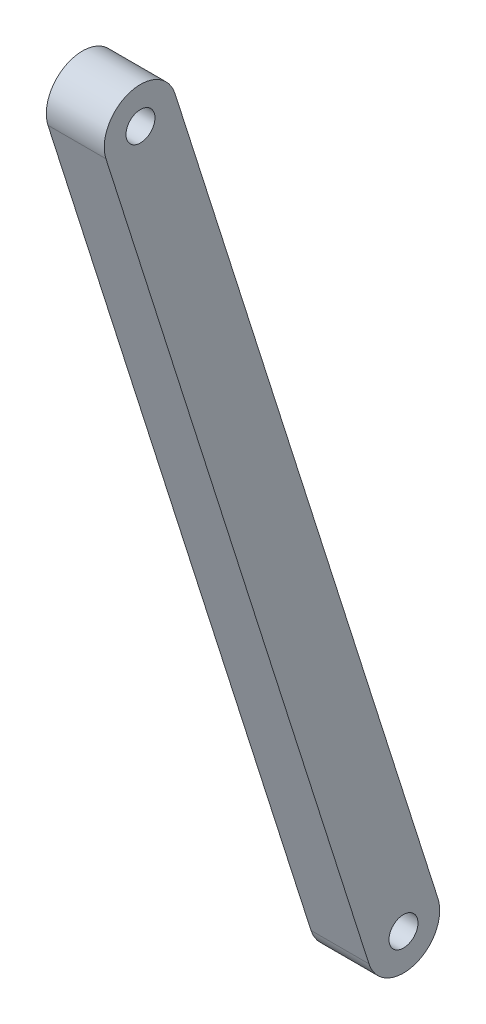
ISO-10303-21;
HEADER;
FILE_DESCRIPTION(('STEP AP214'),'2;1');
FILE_NAME('part.step','',(''),(''),'','','');
FILE_SCHEMA(('AUTOMOTIVE_DESIGN { 1 0 10303 214 1 1 1 1 }'));
ENDSEC;
DATA;
#1=APPLICATION_CONTEXT('core data for automotive mechanical design processes');
#2=APPLICATION_PROTOCOL_DEFINITION('international standard','automotive_design',2000,#1);
#3=PRODUCT_CONTEXT('',#1,'mechanical');
#4=PRODUCT('Part','Part','',(#3));
#5=PRODUCT_RELATED_PRODUCT_CATEGORY('part','',(#4));
#6=PRODUCT_DEFINITION_FORMATION('','',#4);
#7=PRODUCT_DEFINITION_CONTEXT('part definition',#1,'design');
#8=PRODUCT_DEFINITION('design','',#6,#7);
#9=PRODUCT_DEFINITION_SHAPE('','',#8);
#10=(LENGTH_UNIT() NAMED_UNIT(*) SI_UNIT(.MILLI.,.METRE.));
#11=(NAMED_UNIT(*) PLANE_ANGLE_UNIT() SI_UNIT($,.RADIAN.));
#12=(NAMED_UNIT(*) SI_UNIT($,.STERADIAN.) SOLID_ANGLE_UNIT());
#13=UNCERTAINTY_MEASURE_WITH_UNIT(LENGTH_MEASURE(1.E-05),#10,'distance_accuracy_value','');
#14=(GEOMETRIC_REPRESENTATION_CONTEXT(3) GLOBAL_UNCERTAINTY_ASSIGNED_CONTEXT((#13)) GLOBAL_UNIT_ASSIGNED_CONTEXT((#10,
#11,#12)) REPRESENTATION_CONTEXT('',''));
#15=CARTESIAN_POINT('',(0.,0.,0.));
#16=DIRECTION('',(0.,0.,1.));
#17=DIRECTION('',(1.,0.,0.));
#18=AXIS2_PLACEMENT_3D('',#15,#16,#17);
#19=CARTESIAN_POINT('',(4.,166.321108356301,7.35966344883771));
#20=DIRECTION('',(1.,0.,0.));
#21=DIRECTION('',(0.,0.,-1.));
#22=AXIS2_PLACEMENT_3D('',#19,#20,#21);
#23=PLANE('',#22);
#24=CARTESIAN_POINT('',(4.,166.321108356301,7.35966344883771));
#25=DIRECTION('',(1.,0.,0.));
#26=DIRECTION('',(0.,0.,-1.));
#27=AXIS2_PLACEMENT_3D('',#24,#25,#26);
#28=CIRCLE('',#27,2.);
#29=CARTESIAN_POINT('',(4.,166.321108356301,5.35966344883771));
#30=VERTEX_POINT('',#29);
#31=EDGE_CURVE('E101',#30,#30,#28,.T.);
#32=ORIENTED_EDGE('',*,*,#31,.F.);
#33=EDGE_LOOP('',(#32));
#34=FACE_BOUND('',#33,.T.);
#35=CARTESIAN_POINT('',(4.,166.321108356301,7.35966344883771));
#36=DIRECTION('',(1.,0.,0.));
#37=DIRECTION('',(0.,0.,-1.));
#38=AXIS2_PLACEMENT_3D('',#35,#36,#37);
#39=CIRCLE('',#38,4.99999999999999);
#40=CARTESIAN_POINT('',(4.,167.833551939199,2.59389861950024));
#41=VERTEX_POINT('',#40);
#42=CARTESIAN_POINT('',(4.,164.808664773403,12.1254282781752));
#43=VERTEX_POINT('',#42);
#44=EDGE_CURVE('E86',#41,#43,#39,.T.);
#45=ORIENTED_EDGE('',*,*,#44,.T.);
#46=DIRECTION('',(0.,-0.953152965867495,-0.302488716579641));
#47=VECTOR('',#46,1.);
#48=CARTESIAN_POINT('',(4.,164.808664773403,12.1254282781752));
#49=LINE('',#48,#47);
#50=CARTESIAN_POINT('',(4.,50.4303088693032,-24.1732177113817));
#51=VERTEX_POINT('',#50);
#52=EDGE_CURVE('E81',#43,#51,#49,.T.);
#53=ORIENTED_EDGE('',*,*,#52,.T.);
#54=CARTESIAN_POINT('',(4.,51.9427524522014,-28.9389825407192));
#55=DIRECTION('',(1.,0.,0.));
#56=DIRECTION('',(0.,0.,-1.));
#57=AXIS2_PLACEMENT_3D('',#54,#55,#56);
#58=CIRCLE('',#57,4.99999999999999);
#59=CARTESIAN_POINT('',(4.,53.4551960350996,-33.7047473700566));
#60=VERTEX_POINT('',#59);
#61=EDGE_CURVE('E84',#51,#60,#58,.T.);
#62=ORIENTED_EDGE('',*,*,#61,.T.);
#63=DIRECTION('',(0.,0.953152965867495,0.302488716579641));
#64=VECTOR('',#63,1.);
#65=CARTESIAN_POINT('',(4.,167.833551939199,2.59389861950024));
#66=LINE('',#65,#64);
#67=EDGE_CURVE('E51',#60,#41,#66,.T.);
#68=ORIENTED_EDGE('',*,*,#67,.T.);
#69=EDGE_LOOP('',(#45,#53,#62,#68));
#70=FACE_BOUND('',#69,.T.);
#71=CARTESIAN_POINT('',(4.,51.9427524522014,-28.9389825407192));
#72=DIRECTION('',(1.,0.,0.));
#73=DIRECTION('',(0.,0.,-1.));
#74=AXIS2_PLACEMENT_3D('',#71,#72,#73);
#75=CIRCLE('',#74,2.00000000000001);
#76=CARTESIAN_POINT('',(4.,51.9427524522014,-30.9389825407192));
#77=VERTEX_POINT('',#76);
#78=EDGE_CURVE('E116',#77,#77,#75,.T.);
#79=ORIENTED_EDGE('',*,*,#78,.F.);
#80=EDGE_LOOP('',(#79));
#81=FACE_BOUND('',#80,.T.);
#82=ADVANCED_FACE('F34',(#34,#70,#81),#23,.T.);
#83=CARTESIAN_POINT('',(-4.,166.321108356301,7.35966344883771));
#84=DIRECTION('',(1.,0.,0.));
#85=DIRECTION('',(0.,0.,-1.));
#86=AXIS2_PLACEMENT_3D('',#83,#84,#85);
#87=PLANE('',#86);
#88=CARTESIAN_POINT('',(-4.,166.321108356301,7.35966344883771));
#89=DIRECTION('',(1.,0.,0.));
#90=DIRECTION('',(0.,0.,-1.));
#91=AXIS2_PLACEMENT_3D('',#88,#89,#90);
#92=CIRCLE('',#91,4.99999999999999);
#93=CARTESIAN_POINT('',(-4.,167.833551939199,2.59389861950024));
#94=VERTEX_POINT('',#93);
#95=CARTESIAN_POINT('',(-4.,164.808664773403,12.1254282781752));
#96=VERTEX_POINT('',#95);
#97=EDGE_CURVE('E98',#94,#96,#92,.T.);
#98=ORIENTED_EDGE('',*,*,#97,.F.);
#99=DIRECTION('',(0.,0.953152965867495,0.302488716579641));
#100=VECTOR('',#99,1.);
#101=CARTESIAN_POINT('',(-4.,167.833551939199,2.59389861950024));
#102=LINE('',#101,#100);
#103=CARTESIAN_POINT('',(-4.,53.4551960350996,-33.7047473700566));
#104=VERTEX_POINT('',#103);
#105=EDGE_CURVE('E74',#104,#94,#102,.T.);
#106=ORIENTED_EDGE('',*,*,#105,.F.);
#107=CARTESIAN_POINT('',(-4.,51.9427524522014,-28.9389825407192));
#108=DIRECTION('',(1.,0.,0.));
#109=DIRECTION('',(0.,0.,-1.));
#110=AXIS2_PLACEMENT_3D('',#107,#108,#109);
#111=CIRCLE('',#110,4.99999999999999);
#112=CARTESIAN_POINT('',(-4.,50.4303088693032,-24.1732177113817));
#113=VERTEX_POINT('',#112);
#114=EDGE_CURVE('E68',#113,#104,#111,.T.);
#115=ORIENTED_EDGE('',*,*,#114,.F.);
#116=DIRECTION('',(0.,-0.953152965867495,-0.302488716579641));
#117=VECTOR('',#116,1.);
#118=CARTESIAN_POINT('',(-4.,164.808664773403,12.1254282781752));
#119=LINE('',#118,#117);
#120=EDGE_CURVE('E90',#96,#113,#119,.T.);
#121=ORIENTED_EDGE('',*,*,#120,.F.);
#122=EDGE_LOOP('',(#98,#106,#115,#121));
#123=FACE_BOUND('',#122,.T.);
#124=CARTESIAN_POINT('',(-4.,166.321108356301,7.35966344883771));
#125=DIRECTION('',(1.,0.,0.));
#126=DIRECTION('',(0.,0.,-1.));
#127=AXIS2_PLACEMENT_3D('',#124,#125,#126);
#128=CIRCLE('',#127,2.);
#129=CARTESIAN_POINT('',(-4.,166.321108356301,5.35966344883771));
#130=VERTEX_POINT('',#129);
#131=EDGE_CURVE('E113',#130,#130,#128,.T.);
#132=ORIENTED_EDGE('',*,*,#131,.T.);
#133=EDGE_LOOP('',(#132));
#134=FACE_BOUND('',#133,.T.);
#135=CARTESIAN_POINT('',(-4.,51.9427524522014,-28.9389825407192));
#136=DIRECTION('',(1.,0.,0.));
#137=DIRECTION('',(0.,0.,-1.));
#138=AXIS2_PLACEMENT_3D('',#135,#136,#137);
#139=CIRCLE('',#138,2.00000000000001);
#140=CARTESIAN_POINT('',(-4.,51.9427524522014,-30.9389825407192));
#141=VERTEX_POINT('',#140);
#142=EDGE_CURVE('E119',#141,#141,#139,.T.);
#143=ORIENTED_EDGE('',*,*,#142,.T.);
#144=EDGE_LOOP('',(#143));
#145=FACE_BOUND('',#144,.T.);
#146=ADVANCED_FACE('F109',(#123,#134,#145),#87,.F.);
#147=CARTESIAN_POINT('',(4.,166.321108356301,7.35966344883771));
#148=DIRECTION('',(-1.,0.,0.));
#149=DIRECTION('',(0.,0.,1.));
#150=AXIS2_PLACEMENT_3D('',#147,#148,#149);
#151=CYLINDRICAL_SURFACE('',#150,4.99999999999999);
#152=ORIENTED_EDGE('',*,*,#97,.T.);
#153=DIRECTION('',(-1.,0.,0.));
#154=VECTOR('',#153,1.);
#155=CARTESIAN_POINT('',(4.,164.808664773403,12.1254282781752));
#156=LINE('',#155,#154);
#157=EDGE_CURVE('E11',#43,#96,#156,.T.);
#158=ORIENTED_EDGE('',*,*,#157,.F.);
#159=ORIENTED_EDGE('',*,*,#44,.F.);
#160=DIRECTION('',(-1.,0.,0.));
#161=VECTOR('',#160,1.);
#162=CARTESIAN_POINT('',(4.,167.833551939199,2.59389861950024));
#163=LINE('',#162,#161);
#164=EDGE_CURVE('E94',#41,#94,#163,.T.);
#165=ORIENTED_EDGE('',*,*,#164,.T.);
#166=EDGE_LOOP('',(#152,#158,#159,#165));
#167=FACE_BOUND('',#166,.T.);
#168=ADVANCED_FACE('F36',(#167),#151,.T.);
#169=CARTESIAN_POINT('',(4.,164.808664773403,12.1254282781752));
#170=DIRECTION('',(0.,0.302488716579641,-0.953152965867495));
#171=DIRECTION('',(0.,0.953152965867495,0.302488716579641));
#172=AXIS2_PLACEMENT_3D('',#169,#170,#171);
#173=PLANE('',#172);
#174=ORIENTED_EDGE('',*,*,#120,.T.);
#175=DIRECTION('',(-1.,0.,0.));
#176=VECTOR('',#175,1.);
#177=CARTESIAN_POINT('',(4.,50.4303088693032,-24.1732177113817));
#178=LINE('',#177,#176);
#179=EDGE_CURVE('E43',#51,#113,#178,.T.);
#180=ORIENTED_EDGE('',*,*,#179,.F.);
#181=ORIENTED_EDGE('',*,*,#52,.F.);
#182=ORIENTED_EDGE('',*,*,#157,.T.);
#183=EDGE_LOOP('',(#174,#180,#181,#182));
#184=FACE_BOUND('',#183,.T.);
#185=ADVANCED_FACE('F89',(#184),#173,.F.);
#186=CARTESIAN_POINT('',(4.,51.9427524522014,-28.9389825407192));
#187=DIRECTION('',(-1.,0.,0.));
#188=DIRECTION('',(0.,0.,1.));
#189=AXIS2_PLACEMENT_3D('',#186,#187,#188);
#190=CYLINDRICAL_SURFACE('',#189,4.99999999999999);
#191=ORIENTED_EDGE('',*,*,#114,.T.);
#192=DIRECTION('',(-1.,0.,0.));
#193=VECTOR('',#192,1.);
#194=CARTESIAN_POINT('',(4.,53.4551960350996,-33.7047473700566));
#195=LINE('',#194,#193);
#196=EDGE_CURVE('E91',#60,#104,#195,.T.);
#197=ORIENTED_EDGE('',*,*,#196,.F.);
#198=ORIENTED_EDGE('',*,*,#61,.F.);
#199=ORIENTED_EDGE('',*,*,#179,.T.);
#200=EDGE_LOOP('',(#191,#197,#198,#199));
#201=FACE_BOUND('',#200,.T.);
#202=ADVANCED_FACE('F92',(#201),#190,.T.);
#203=CARTESIAN_POINT('',(4.,167.833551939199,2.59389861950024));
#204=DIRECTION('',(0.,-0.302488716579641,0.953152965867495));
#205=DIRECTION('',(0.,-0.953152965867495,-0.302488716579641));
#206=AXIS2_PLACEMENT_3D('',#203,#204,#205);
#207=PLANE('',#206);
#208=ORIENTED_EDGE('',*,*,#105,.T.);
#209=ORIENTED_EDGE('',*,*,#164,.F.);
#210=ORIENTED_EDGE('',*,*,#67,.F.);
#211=ORIENTED_EDGE('',*,*,#196,.T.);
#212=EDGE_LOOP('',(#208,#209,#210,#211));
#213=FACE_BOUND('',#212,.T.);
#214=ADVANCED_FACE('F106',(#213),#207,.F.);
#215=CARTESIAN_POINT('',(4.,166.321108356301,7.35966344883771));
#216=DIRECTION('',(-1.,0.,0.));
#217=DIRECTION('',(0.,0.,1.));
#218=AXIS2_PLACEMENT_3D('',#215,#216,#217);
#219=CYLINDRICAL_SURFACE('',#218,2.);
#220=ORIENTED_EDGE('',*,*,#31,.T.);
#221=EDGE_LOOP('',(#220));
#222=FACE_BOUND('',#221,.T.);
#223=ORIENTED_EDGE('',*,*,#131,.F.);
#224=EDGE_LOOP('',(#223));
#225=FACE_BOUND('',#224,.T.);
#226=ADVANCED_FACE('F136',(#222,#225),#219,.F.);
#227=CARTESIAN_POINT('',(4.,51.9427524522014,-28.9389825407192));
#228=DIRECTION('',(-1.,0.,0.));
#229=DIRECTION('',(0.,0.,1.));
#230=AXIS2_PLACEMENT_3D('',#227,#228,#229);
#231=CYLINDRICAL_SURFACE('',#230,2.00000000000001);
#232=ORIENTED_EDGE('',*,*,#78,.T.);
#233=EDGE_LOOP('',(#232));
#234=FACE_BOUND('',#233,.T.);
#235=ORIENTED_EDGE('',*,*,#142,.F.);
#236=EDGE_LOOP('',(#235));
#237=FACE_BOUND('',#236,.T.);
#238=ADVANCED_FACE('F125',(#234,#237),#231,.F.);
#239=CLOSED_SHELL('',(#82,#146,#168,#185,#202,#214,#226,#238));
#240=MANIFOLD_SOLID_BREP('B2',#239);
#241=ADVANCED_BREP_SHAPE_REPRESENTATION('',(#18,#240),#14);
#242=SHAPE_DEFINITION_REPRESENTATION(#9,#241);
ENDSEC;
END-ISO-10303-21;
